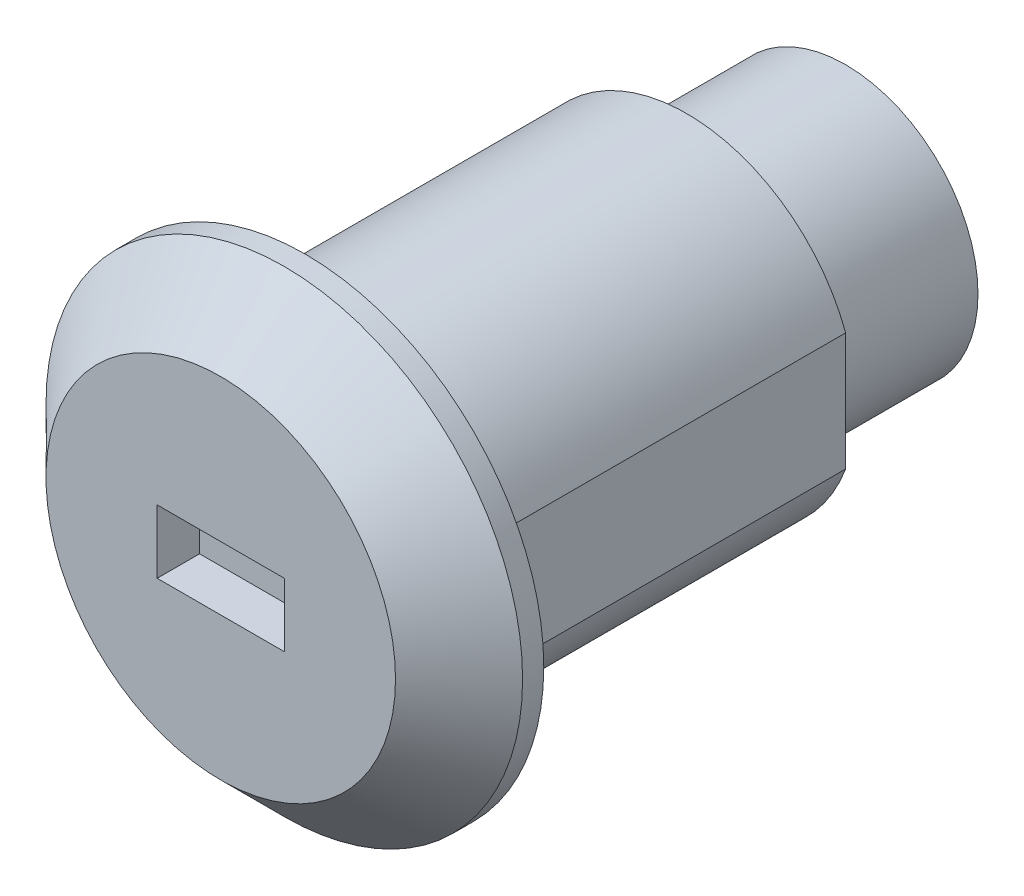
ISO-10303-21;
HEADER;
FILE_DESCRIPTION(('STEP AP214'),'2;1');
FILE_NAME('part.step','',(''),(''),'','','');
FILE_SCHEMA(('AUTOMOTIVE_DESIGN { 1 0 10303 214 1 1 1 1 }'));
ENDSEC;
DATA;
#1=APPLICATION_CONTEXT('core data for automotive mechanical design processes');
#2=APPLICATION_PROTOCOL_DEFINITION('international standard','automotive_design',2000,#1);
#3=PRODUCT_CONTEXT('',#1,'mechanical');
#4=PRODUCT('Part','Part','',(#3));
#5=PRODUCT_RELATED_PRODUCT_CATEGORY('part','',(#4));
#6=PRODUCT_DEFINITION_FORMATION('','',#4);
#7=PRODUCT_DEFINITION_CONTEXT('part definition',#1,'design');
#8=PRODUCT_DEFINITION('design','',#6,#7);
#9=PRODUCT_DEFINITION_SHAPE('','',#8);
#10=(LENGTH_UNIT() NAMED_UNIT(*) SI_UNIT(.MILLI.,.METRE.));
#11=(NAMED_UNIT(*) PLANE_ANGLE_UNIT() SI_UNIT($,.RADIAN.));
#12=(NAMED_UNIT(*) SI_UNIT($,.STERADIAN.) SOLID_ANGLE_UNIT());
#13=UNCERTAINTY_MEASURE_WITH_UNIT(LENGTH_MEASURE(1.E-05),#10,'distance_accuracy_value','');
#14=(GEOMETRIC_REPRESENTATION_CONTEXT(3) GLOBAL_UNCERTAINTY_ASSIGNED_CONTEXT((#13)) GLOBAL_UNIT_ASSIGNED_CONTEXT((#10,
#11,#12)) REPRESENTATION_CONTEXT('',''));
#15=CARTESIAN_POINT('',(0.,0.,0.));
#16=DIRECTION('',(0.,0.,1.));
#17=DIRECTION('',(1.,0.,0.));
#18=AXIS2_PLACEMENT_3D('',#15,#16,#17);
#19=CARTESIAN_POINT('',(0.,0.,-18.));
#20=DIRECTION('',(0.,0.,1.));
#21=DIRECTION('',(1.,0.,0.));
#22=AXIS2_PLACEMENT_3D('',#19,#20,#21);
#23=PLANE('',#22);
#24=DIRECTION('',(0.,1.,0.));
#25=VECTOR('',#24,1.);
#26=CARTESIAN_POINT('',(7.5,2.78388218141502,-18.));
#27=LINE('',#26,#25);
#28=CARTESIAN_POINT('',(7.5,-2.78388218141502,-18.));
#29=VERTEX_POINT('',#28);
#30=CARTESIAN_POINT('',(7.5,2.78388218141502,-18.));
#31=VERTEX_POINT('',#30);
#32=EDGE_CURVE('E112',#29,#31,#27,.T.);
#33=ORIENTED_EDGE('',*,*,#32,.F.);
#34=CARTESIAN_POINT('',(0.,0.,-18.));
#35=DIRECTION('',(0.,0.,1.));
#36=DIRECTION('',(1.,0.,0.));
#37=AXIS2_PLACEMENT_3D('',#34,#35,#36);
#38=CIRCLE('',#37,8.);
#39=CARTESIAN_POINT('',(-7.5,-2.78388218141501,-18.));
#40=VERTEX_POINT('',#39);
#41=EDGE_CURVE('E137',#40,#29,#38,.T.);
#42=ORIENTED_EDGE('',*,*,#41,.F.);
#43=DIRECTION('',(0.,-1.,0.));
#44=VECTOR('',#43,1.);
#45=CARTESIAN_POINT('',(-7.5,2.78388218141502,-18.));
#46=LINE('',#45,#44);
#47=CARTESIAN_POINT('',(-7.5,2.78388218141502,-18.));
#48=VERTEX_POINT('',#47);
#49=EDGE_CURVE('E115',#48,#40,#46,.T.);
#50=ORIENTED_EDGE('',*,*,#49,.F.);
#51=CARTESIAN_POINT('',(0.,0.,-18.));
#52=DIRECTION('',(0.,0.,1.));
#53=DIRECTION('',(1.,0.,0.));
#54=AXIS2_PLACEMENT_3D('',#51,#52,#53);
#55=CIRCLE('',#54,8.);
#56=EDGE_CURVE('E126',#31,#48,#55,.T.);
#57=ORIENTED_EDGE('',*,*,#56,.F.);
#58=EDGE_LOOP('',(#33,#42,#50,#57));
#59=FACE_BOUND('',#58,.T.);
#60=CARTESIAN_POINT('',(0.,0.,-18.));
#61=DIRECTION('',(0.,0.,1.));
#62=DIRECTION('',(1.,0.,0.));
#63=AXIS2_PLACEMENT_3D('',#60,#61,#62);
#64=CIRCLE('',#63,6.25);
#65=CARTESIAN_POINT('',(6.25,0.,-18.));
#66=VERTEX_POINT('',#65);
#67=EDGE_CURVE('E12',#66,#66,#64,.F.);
#68=ORIENTED_EDGE('',*,*,#67,.F.);
#69=EDGE_LOOP('',(#68));
#70=FACE_BOUND('',#69,.T.);
#71=ADVANCED_FACE('F37',(#59,#70),#23,.F.);
#72=CARTESIAN_POINT('',(0.,0.,0.));
#73=DIRECTION('',(0.,0.,1.));
#74=DIRECTION('',(1.,0.,0.));
#75=AXIS2_PLACEMENT_3D('',#72,#73,#74);
#76=PLANE('',#75);
#77=CARTESIAN_POINT('',(0.,0.,0.));
#78=DIRECTION('',(0.,0.,1.));
#79=DIRECTION('',(1.,0.,0.));
#80=AXIS2_PLACEMENT_3D('',#77,#78,#79);
#81=CIRCLE('',#80,11.25);
#82=CARTESIAN_POINT('',(11.25,0.,0.));
#83=VERTEX_POINT('',#82);
#84=EDGE_CURVE('E164',#83,#83,#81,.T.);
#85=ORIENTED_EDGE('',*,*,#84,.F.);
#86=EDGE_LOOP('',(#85));
#87=FACE_BOUND('',#86,.T.);
#88=DIRECTION('',(0.,1.,0.));
#89=VECTOR('',#88,1.);
#90=CARTESIAN_POINT('',(-7.5,2.78388218141502,0.));
#91=LINE('',#90,#89);
#92=CARTESIAN_POINT('',(-7.5,-2.78388218141501,0.));
#93=VERTEX_POINT('',#92);
#94=CARTESIAN_POINT('',(-7.5,2.78388218141502,0.));
#95=VERTEX_POINT('',#94);
#96=EDGE_CURVE('E52',#93,#95,#91,.T.);
#97=ORIENTED_EDGE('',*,*,#96,.F.);
#98=CARTESIAN_POINT('',(0.,0.,0.));
#99=DIRECTION('',(0.,0.,-1.));
#100=DIRECTION('',(-1.,0.,0.));
#101=AXIS2_PLACEMENT_3D('',#98,#99,#100);
#102=CIRCLE('',#101,8.);
#103=CARTESIAN_POINT('',(7.5,-2.78388218141502,0.));
#104=VERTEX_POINT('',#103);
#105=EDGE_CURVE('E57',#104,#93,#102,.T.);
#106=ORIENTED_EDGE('',*,*,#105,.F.);
#107=DIRECTION('',(0.,-1.,0.));
#108=VECTOR('',#107,1.);
#109=CARTESIAN_POINT('',(7.5,2.78388218141502,0.));
#110=LINE('',#109,#108);
#111=CARTESIAN_POINT('',(7.5,2.78388218141502,0.));
#112=VERTEX_POINT('',#111);
#113=EDGE_CURVE('E99',#112,#104,#110,.T.);
#114=ORIENTED_EDGE('',*,*,#113,.F.);
#115=CARTESIAN_POINT('',(0.,0.,0.));
#116=DIRECTION('',(0.,0.,-1.));
#117=DIRECTION('',(-1.,0.,0.));
#118=AXIS2_PLACEMENT_3D('',#115,#116,#117);
#119=CIRCLE('',#118,8.);
#120=EDGE_CURVE('E103',#95,#112,#119,.T.);
#121=ORIENTED_EDGE('',*,*,#120,.F.);
#122=EDGE_LOOP('',(#97,#106,#114,#121));
#123=FACE_BOUND('',#122,.T.);
#124=ADVANCED_FACE('F101',(#87,#123),#76,.F.);
#125=CARTESIAN_POINT('',(0.,0.,4.));
#126=DIRECTION('',(0.,0.,-1.));
#127=DIRECTION('',(-1.,0.,0.));
#128=AXIS2_PLACEMENT_3D('',#125,#126,#127);
#129=CYLINDRICAL_SURFACE('',#128,11.25);
#130=CARTESIAN_POINT('',(0.,0.,0.999999999999984));
#131=DIRECTION('',(0.,0.,1.));
#132=DIRECTION('',(1.,0.,0.));
#133=AXIS2_PLACEMENT_3D('',#130,#131,#132);
#134=CIRCLE('',#133,11.25);
#135=CARTESIAN_POINT('',(11.25,0.,0.999999999999984));
#136=VERTEX_POINT('',#135);
#137=EDGE_CURVE('E45',#136,#136,#134,.F.);
#138=ORIENTED_EDGE('',*,*,#137,.T.);
#139=EDGE_LOOP('',(#138));
#140=FACE_BOUND('',#139,.T.);
#141=ORIENTED_EDGE('',*,*,#84,.T.);
#142=EDGE_LOOP('',(#141));
#143=FACE_BOUND('',#142,.T.);
#144=ADVANCED_FACE('F39',(#140,#143),#129,.T.);
#145=CARTESIAN_POINT('',(0.,0.,4.));
#146=DIRECTION('',(0.,0.,1.));
#147=DIRECTION('',(1.,0.,0.));
#148=AXIS2_PLACEMENT_3D('',#145,#146,#147);
#149=PLANE('',#148);
#150=DIRECTION('',(0.,-1.,0.));
#151=VECTOR('',#150,1.);
#152=CARTESIAN_POINT('',(-3.,1.5,4.));
#153=LINE('',#152,#151);
#154=CARTESIAN_POINT('',(-3.,1.5,4.));
#155=VERTEX_POINT('',#154);
#156=CARTESIAN_POINT('',(-3.,-1.5,4.));
#157=VERTEX_POINT('',#156);
#158=EDGE_CURVE('E138',#155,#157,#153,.T.);
#159=ORIENTED_EDGE('',*,*,#158,.F.);
#160=DIRECTION('',(-1.,0.,0.));
#161=VECTOR('',#160,1.);
#162=CARTESIAN_POINT('',(-3.,1.5,4.));
#163=LINE('',#162,#161);
#164=CARTESIAN_POINT('',(3.,1.5,4.));
#165=VERTEX_POINT('',#164);
#166=EDGE_CURVE('E146',#165,#155,#163,.T.);
#167=ORIENTED_EDGE('',*,*,#166,.F.);
#168=DIRECTION('',(0.,1.,0.));
#169=VECTOR('',#168,1.);
#170=CARTESIAN_POINT('',(3.,1.5,4.));
#171=LINE('',#170,#169);
#172=CARTESIAN_POINT('',(3.,-1.5,4.));
#173=VERTEX_POINT('',#172);
#174=EDGE_CURVE('E143',#173,#165,#171,.T.);
#175=ORIENTED_EDGE('',*,*,#174,.F.);
#176=DIRECTION('',(1.,0.,0.));
#177=VECTOR('',#176,1.);
#178=CARTESIAN_POINT('',(-3.,-1.5,4.));
#179=LINE('',#178,#177);
#180=EDGE_CURVE('E140',#157,#173,#179,.T.);
#181=ORIENTED_EDGE('',*,*,#180,.F.);
#182=EDGE_LOOP('',(#159,#167,#175,#181));
#183=FACE_BOUND('',#182,.T.);
#184=CARTESIAN_POINT('',(0.,0.,4.));
#185=DIRECTION('',(0.,0.,1.));
#186=DIRECTION('',(1.,0.,0.));
#187=AXIS2_PLACEMENT_3D('',#184,#185,#186);
#188=CIRCLE('',#187,8.24999999999999);
#189=CARTESIAN_POINT('',(8.24999999999999,0.,4.));
#190=VERTEX_POINT('',#189);
#191=EDGE_CURVE('E173',#190,#190,#188,.T.);
#192=ORIENTED_EDGE('',*,*,#191,.T.);
#193=EDGE_LOOP('',(#192));
#194=FACE_BOUND('',#193,.T.);
#195=ADVANCED_FACE('F184',(#183,#194),#149,.T.);
#196=CARTESIAN_POINT('',(0.,0.,4.));
#197=DIRECTION('',(0.,0.,-1.));
#198=DIRECTION('',(-1.,0.,0.));
#199=AXIS2_PLACEMENT_3D('',#196,#197,#198);
#200=CONICAL_SURFACE('',#199,8.24999999999999,0.785398163397447);
#201=ORIENTED_EDGE('',*,*,#137,.F.);
#202=EDGE_LOOP('',(#201));
#203=FACE_BOUND('',#202,.T.);
#204=ORIENTED_EDGE('',*,*,#191,.F.);
#205=EDGE_LOOP('',(#204));
#206=FACE_BOUND('',#205,.T.);
#207=ADVANCED_FACE('F180',(#203,#206),#200,.T.);
#208=CARTESIAN_POINT('',(-3.,1.5,2.));
#209=DIRECTION('',(-1.,0.,0.));
#210=DIRECTION('',(0.,0.,1.));
#211=AXIS2_PLACEMENT_3D('',#208,#209,#210);
#212=PLANE('',#211);
#213=ORIENTED_EDGE('',*,*,#158,.T.);
#214=DIRECTION('',(0.,0.,1.));
#215=VECTOR('',#214,1.);
#216=CARTESIAN_POINT('',(-3.,-1.5,2.));
#217=LINE('',#216,#215);
#218=CARTESIAN_POINT('',(-3.,-1.5,2.));
#219=VERTEX_POINT('',#218);
#220=EDGE_CURVE('E161',#219,#157,#217,.T.);
#221=ORIENTED_EDGE('',*,*,#220,.F.);
#222=DIRECTION('',(0.,-1.,0.));
#223=VECTOR('',#222,1.);
#224=CARTESIAN_POINT('',(-3.,1.5,2.));
#225=LINE('',#224,#223);
#226=CARTESIAN_POINT('',(-3.,1.5,2.));
#227=VERTEX_POINT('',#226);
#228=EDGE_CURVE('E149',#227,#219,#225,.T.);
#229=ORIENTED_EDGE('',*,*,#228,.F.);
#230=DIRECTION('',(0.,0.,1.));
#231=VECTOR('',#230,1.);
#232=CARTESIAN_POINT('',(-3.,1.5,2.));
#233=LINE('',#232,#231);
#234=EDGE_CURVE('E162',#227,#155,#233,.T.);
#235=ORIENTED_EDGE('',*,*,#234,.T.);
#236=EDGE_LOOP('',(#213,#221,#229,#235));
#237=FACE_BOUND('',#236,.T.);
#238=ADVANCED_FACE('F183',(#237),#212,.F.);
#239=CARTESIAN_POINT('',(-3.,1.5,2.));
#240=DIRECTION('',(0.,1.,0.));
#241=DIRECTION('',(-1.,0.,0.));
#242=AXIS2_PLACEMENT_3D('',#239,#240,#241);
#243=PLANE('',#242);
#244=ORIENTED_EDGE('',*,*,#166,.T.);
#245=ORIENTED_EDGE('',*,*,#234,.F.);
#246=DIRECTION('',(-1.,0.,0.));
#247=VECTOR('',#246,1.);
#248=CARTESIAN_POINT('',(-3.,1.5,2.));
#249=LINE('',#248,#247);
#250=CARTESIAN_POINT('',(3.,1.5,2.));
#251=VERTEX_POINT('',#250);
#252=EDGE_CURVE('E158',#251,#227,#249,.T.);
#253=ORIENTED_EDGE('',*,*,#252,.F.);
#254=DIRECTION('',(0.,0.,1.));
#255=VECTOR('',#254,1.);
#256=CARTESIAN_POINT('',(3.,1.5,2.));
#257=LINE('',#256,#255);
#258=EDGE_CURVE('E165',#251,#165,#257,.T.);
#259=ORIENTED_EDGE('',*,*,#258,.T.);
#260=EDGE_LOOP('',(#244,#245,#253,#259));
#261=FACE_BOUND('',#260,.T.);
#262=ADVANCED_FACE('F224',(#261),#243,.F.);
#263=CARTESIAN_POINT('',(3.,1.5,2.));
#264=DIRECTION('',(1.,0.,0.));
#265=DIRECTION('',(0.,1.,0.));
#266=AXIS2_PLACEMENT_3D('',#263,#264,#265);
#267=PLANE('',#266);
#268=ORIENTED_EDGE('',*,*,#174,.T.);
#269=ORIENTED_EDGE('',*,*,#258,.F.);
#270=DIRECTION('',(0.,1.,0.));
#271=VECTOR('',#270,1.);
#272=CARTESIAN_POINT('',(3.,1.5,2.));
#273=LINE('',#272,#271);
#274=CARTESIAN_POINT('',(3.,-1.5,2.));
#275=VERTEX_POINT('',#274);
#276=EDGE_CURVE('E155',#275,#251,#273,.T.);
#277=ORIENTED_EDGE('',*,*,#276,.F.);
#278=DIRECTION('',(0.,0.,1.));
#279=VECTOR('',#278,1.);
#280=CARTESIAN_POINT('',(3.,-1.5,2.));
#281=LINE('',#280,#279);
#282=EDGE_CURVE('E167',#275,#173,#281,.T.);
#283=ORIENTED_EDGE('',*,*,#282,.T.);
#284=EDGE_LOOP('',(#268,#269,#277,#283));
#285=FACE_BOUND('',#284,.T.);
#286=ADVANCED_FACE('F227',(#285),#267,.F.);
#287=CARTESIAN_POINT('',(-3.,-1.5,2.));
#288=DIRECTION('',(0.,-1.,0.));
#289=DIRECTION('',(1.,0.,0.));
#290=AXIS2_PLACEMENT_3D('',#287,#288,#289);
#291=PLANE('',#290);
#292=ORIENTED_EDGE('',*,*,#180,.T.);
#293=ORIENTED_EDGE('',*,*,#282,.F.);
#294=DIRECTION('',(1.,0.,0.));
#295=VECTOR('',#294,1.);
#296=CARTESIAN_POINT('',(-3.,-1.5,2.));
#297=LINE('',#296,#295);
#298=EDGE_CURVE('E152',#219,#275,#297,.T.);
#299=ORIENTED_EDGE('',*,*,#298,.F.);
#300=ORIENTED_EDGE('',*,*,#220,.T.);
#301=EDGE_LOOP('',(#292,#293,#299,#300));
#302=FACE_BOUND('',#301,.T.);
#303=ADVANCED_FACE('F222',(#302),#291,.F.);
#304=CARTESIAN_POINT('',(-3.,-1.5,2.));
#305=DIRECTION('',(0.,0.,1.));
#306=DIRECTION('',(1.,0.,0.));
#307=AXIS2_PLACEMENT_3D('',#304,#305,#306);
#308=PLANE('',#307);
#309=ORIENTED_EDGE('',*,*,#228,.T.);
#310=ORIENTED_EDGE('',*,*,#298,.T.);
#311=ORIENTED_EDGE('',*,*,#276,.T.);
#312=ORIENTED_EDGE('',*,*,#252,.T.);
#313=EDGE_LOOP('',(#309,#310,#311,#312));
#314=FACE_BOUND('',#313,.T.);
#315=ADVANCED_FACE('F211',(#314),#308,.T.);
#316=CARTESIAN_POINT('',(-7.5,2.78388218141502,-61.9317121994613));
#317=DIRECTION('',(1.,0.,0.));
#318=DIRECTION('',(0.,1.,0.));
#319=AXIS2_PLACEMENT_3D('',#316,#317,#318);
#320=PLANE('',#319);
#321=DIRECTION('',(0.,0.,1.));
#322=VECTOR('',#321,1.);
#323=CARTESIAN_POINT('',(-7.5,2.78388218141502,-61.9317121994613));
#324=LINE('',#323,#322);
#325=EDGE_CURVE('E120',#48,#95,#324,.T.);
#326=ORIENTED_EDGE('',*,*,#325,.F.);
#327=ORIENTED_EDGE('',*,*,#49,.T.);
#328=DIRECTION('',(0.,0.,1.));
#329=VECTOR('',#328,1.);
#330=CARTESIAN_POINT('',(-7.5,-2.78388218141501,-61.9317121994613));
#331=LINE('',#330,#329);
#332=EDGE_CURVE('E132',#40,#93,#331,.T.);
#333=ORIENTED_EDGE('',*,*,#332,.T.);
#334=ORIENTED_EDGE('',*,*,#96,.T.);
#335=EDGE_LOOP('',(#326,#327,#333,#334));
#336=FACE_BOUND('',#335,.T.);
#337=ADVANCED_FACE('F207',(#336),#320,.F.);
#338=CARTESIAN_POINT('',(0.,0.,-61.9317121994613));
#339=DIRECTION('',(0.,0.,1.));
#340=DIRECTION('',(1.,0.,0.));
#341=AXIS2_PLACEMENT_3D('',#338,#339,#340);
#342=CYLINDRICAL_SURFACE('',#341,8.);
#343=ORIENTED_EDGE('',*,*,#332,.F.);
#344=ORIENTED_EDGE('',*,*,#41,.T.);
#345=DIRECTION('',(0.,0.,1.));
#346=VECTOR('',#345,1.);
#347=CARTESIAN_POINT('',(7.5,-2.78388218141502,-61.9317121994613));
#348=LINE('',#347,#346);
#349=EDGE_CURVE('E116',#29,#104,#348,.T.);
#350=ORIENTED_EDGE('',*,*,#349,.T.);
#351=ORIENTED_EDGE('',*,*,#105,.T.);
#352=EDGE_LOOP('',(#343,#344,#350,#351));
#353=FACE_BOUND('',#352,.T.);
#354=ADVANCED_FACE('F210',(#353),#342,.T.);
#355=CARTESIAN_POINT('',(7.5,2.78388218141502,-61.9317121994613));
#356=DIRECTION('',(-1.,0.,0.));
#357=DIRECTION('',(0.,0.,1.));
#358=AXIS2_PLACEMENT_3D('',#355,#356,#357);
#359=PLANE('',#358);
#360=ORIENTED_EDGE('',*,*,#349,.F.);
#361=ORIENTED_EDGE('',*,*,#32,.T.);
#362=DIRECTION('',(0.,0.,1.));
#363=VECTOR('',#362,1.);
#364=CARTESIAN_POINT('',(7.5,2.78388218141502,-61.9317121994613));
#365=LINE('',#364,#363);
#366=EDGE_CURVE('E110',#31,#112,#365,.T.);
#367=ORIENTED_EDGE('',*,*,#366,.T.);
#368=ORIENTED_EDGE('',*,*,#113,.T.);
#369=EDGE_LOOP('',(#360,#361,#367,#368));
#370=FACE_BOUND('',#369,.T.);
#371=ADVANCED_FACE('F111',(#370),#359,.F.);
#372=CARTESIAN_POINT('',(0.,0.,-61.9317121994613));
#373=DIRECTION('',(0.,0.,1.));
#374=DIRECTION('',(1.,0.,0.));
#375=AXIS2_PLACEMENT_3D('',#372,#373,#374);
#376=CYLINDRICAL_SURFACE('',#375,8.);
#377=ORIENTED_EDGE('',*,*,#366,.F.);
#378=ORIENTED_EDGE('',*,*,#56,.T.);
#379=ORIENTED_EDGE('',*,*,#325,.T.);
#380=ORIENTED_EDGE('',*,*,#120,.T.);
#381=EDGE_LOOP('',(#377,#378,#379,#380));
#382=FACE_BOUND('',#381,.T.);
#383=ADVANCED_FACE('F118',(#382),#376,.T.);
#384=CARTESIAN_POINT('',(0.,0.,-72.6776695296637));
#385=DIRECTION('',(0.,0.,1.));
#386=DIRECTION('',(1.,0.,0.));
#387=AXIS2_PLACEMENT_3D('',#384,#385,#386);
#388=CYLINDRICAL_SURFACE('',#387,6.25);
#389=CARTESIAN_POINT('',(0.,0.,-25.5));
#390=DIRECTION('',(0.,0.,1.));
#391=DIRECTION('',(1.,0.,0.));
#392=AXIS2_PLACEMENT_3D('',#389,#390,#391);
#393=CIRCLE('',#392,6.25);
#394=CARTESIAN_POINT('',(6.25,0.,-25.5));
#395=VERTEX_POINT('',#394);
#396=EDGE_CURVE('E121',#395,#395,#393,.T.);
#397=CARTESIAN_POINT('',(6.25,0.,-25.5));
#398=CARTESIAN_POINT('',(6.25,0.,-25.421875));
#399=CARTESIAN_POINT('',(6.25,0.,-25.34375));
#400=CARTESIAN_POINT('',(6.25,0.,-25.1875));
#401=CARTESIAN_POINT('',(6.25,0.,-25.109375));
#402=CARTESIAN_POINT('',(6.25,0.,-24.953125));
#403=CARTESIAN_POINT('',(6.25,0.,-24.875));
#404=CARTESIAN_POINT('',(6.25,0.,-24.71875));
#405=CARTESIAN_POINT('',(6.25,0.,-24.640625));
#406=CARTESIAN_POINT('',(6.25,0.,-24.484375));
#407=CARTESIAN_POINT('',(6.25,0.,-24.40625));
#408=CARTESIAN_POINT('',(6.25,0.,-24.25));
#409=CARTESIAN_POINT('',(6.25,0.,-24.171875));
#410=CARTESIAN_POINT('',(6.25,0.,-24.015625));
#411=CARTESIAN_POINT('',(6.25,0.,-23.9375));
#412=CARTESIAN_POINT('',(6.25,0.,-23.78125));
#413=CARTESIAN_POINT('',(6.25,0.,-23.703125));
#414=CARTESIAN_POINT('',(6.25,0.,-23.546875));
#415=CARTESIAN_POINT('',(6.25,0.,-23.46875));
#416=CARTESIAN_POINT('',(6.25,0.,-23.3125));
#417=CARTESIAN_POINT('',(6.25,0.,-23.234375));
#418=CARTESIAN_POINT('',(6.25,0.,-23.078125));
#419=CARTESIAN_POINT('',(6.25,0.,-23.));
#420=CARTESIAN_POINT('',(6.25,0.,-22.84375));
#421=CARTESIAN_POINT('',(6.25,0.,-22.765625));
#422=CARTESIAN_POINT('',(6.25,0.,-22.609375));
#423=CARTESIAN_POINT('',(6.25,0.,-22.53125));
#424=CARTESIAN_POINT('',(6.25,0.,-22.375));
#425=CARTESIAN_POINT('',(6.25,0.,-22.296875));
#426=CARTESIAN_POINT('',(6.25,0.,-22.140625));
#427=CARTESIAN_POINT('',(6.25,0.,-22.0625));
#428=CARTESIAN_POINT('',(6.25,0.,-21.90625));
#429=CARTESIAN_POINT('',(6.25,0.,-21.828125));
#430=CARTESIAN_POINT('',(6.25,0.,-21.671875));
#431=CARTESIAN_POINT('',(6.25,0.,-21.59375));
#432=CARTESIAN_POINT('',(6.25,0.,-21.4375));
#433=CARTESIAN_POINT('',(6.25,0.,-21.359375));
#434=CARTESIAN_POINT('',(6.25,0.,-21.203125));
#435=CARTESIAN_POINT('',(6.25,0.,-21.125));
#436=CARTESIAN_POINT('',(6.25,0.,-20.96875));
#437=CARTESIAN_POINT('',(6.25,0.,-20.890625));
#438=CARTESIAN_POINT('',(6.25,0.,-20.734375));
#439=CARTESIAN_POINT('',(6.25,0.,-20.65625));
#440=CARTESIAN_POINT('',(6.25,0.,-20.5));
#441=CARTESIAN_POINT('',(6.25,0.,-20.421875));
#442=CARTESIAN_POINT('',(6.25,0.,-20.265625));
#443=CARTESIAN_POINT('',(6.25,0.,-20.1875));
#444=CARTESIAN_POINT('',(6.25,0.,-20.03125));
#445=CARTESIAN_POINT('',(6.25,0.,-19.953125));
#446=CARTESIAN_POINT('',(6.25,0.,-19.796875));
#447=CARTESIAN_POINT('',(6.25,0.,-19.71875));
#448=CARTESIAN_POINT('',(6.25,0.,-19.5625));
#449=CARTESIAN_POINT('',(6.25,0.,-19.484375));
#450=CARTESIAN_POINT('',(6.25,0.,-19.328125));
#451=CARTESIAN_POINT('',(6.25,0.,-19.25));
#452=CARTESIAN_POINT('',(6.25,0.,-19.09375));
#453=CARTESIAN_POINT('',(6.25,0.,-19.015625));
#454=CARTESIAN_POINT('',(6.25,0.,-18.859375));
#455=CARTESIAN_POINT('',(6.25,0.,-18.78125));
#456=CARTESIAN_POINT('',(6.25,0.,-18.625));
#457=CARTESIAN_POINT('',(6.25,0.,-18.546875));
#458=CARTESIAN_POINT('',(6.25,0.,-18.390625));
#459=CARTESIAN_POINT('',(6.25,0.,-18.3125));
#460=CARTESIAN_POINT('',(6.25,0.,-18.15625));
#461=CARTESIAN_POINT('',(6.25,0.,-18.078125));
#462=CARTESIAN_POINT('',(6.25,0.,-18.));
#463=B_SPLINE_CURVE_WITH_KNOTS('',3,(#397,#398,#399,#400,#401,#402,#403,#404,#405,#406,#407,
#408,#409,#410,#411,#412,#413,#414,#415,#416,#417,#418,#419,#420,#421,#422,#423,#424,#425,#426,
#427,#428,#429,#430,#431,#432,#433,#434,#435,#436,#437,#438,#439,#440,#441,#442,#443,#444,#445,
#446,#447,#448,#449,#450,#451,#452,#453,#454,#455,#456,#457,#458,#459,#460,#461,#462),
.UNSPECIFIED.,.F.,.F.,(4,2,2,2,2,2,2,2,2,2,2,2,2,2,2,2,2,2,2,2,2,2,2,2,2,2,2,2,2,2,2,2,4),(0.,
0.234375000000002,0.468749999999997,0.703124999999999,0.937500000000001,1.171875,1.40625,
1.640625,1.875,2.109375,2.34375,2.578125,2.8125,3.046875,3.28125,3.51562499999999,3.75,3.984375,
4.21874999999999,4.453125,4.6875,4.92187499999999,5.15624999999999,5.390625,5.62499999999999,
5.85937499999999,6.09374999999999,6.32812499999999,6.56249999999999,6.79687499999999,7.03125,
7.26562499999999,7.49999999999999),.UNSPECIFIED.);
#464=EDGE_CURVE('BSEAM205',#395,#66,#463,.T.);
#465=ORIENTED_EDGE('',*,*,#396,.T.);
#466=ORIENTED_EDGE('',*,*,#67,.T.);
#467=ORIENTED_EDGE('',*,*,#464,.T.);
#468=ORIENTED_EDGE('',*,*,#464,.F.);
#469=EDGE_LOOP('',(#465,#467,#466,#468));
#470=FACE_BOUND('',#469,.T.);
#471=ADVANCED_FACE('F205',(#470),#388,.T.);
#472=CARTESIAN_POINT('',(0.,0.,-25.5));
#473=DIRECTION('',(0.,0.,1.));
#474=DIRECTION('',(1.,0.,0.));
#475=AXIS2_PLACEMENT_3D('',#472,#473,#474);
#476=PLANE('',#475);
#477=ORIENTED_EDGE('',*,*,#396,.F.);
#478=EDGE_LOOP('',(#477));
#479=FACE_BOUND('',#478,.T.);
#480=ADVANCED_FACE('F287',(#479),#476,.F.);
#481=CLOSED_SHELL('',(#71,#124,#144,#195,#207,#238,#262,#286,#303,#315,#337,#354,#371,#383,#471,#480));
#482=MANIFOLD_SOLID_BREP('B2',#481);
#483=ADVANCED_BREP_SHAPE_REPRESENTATION('',(#18,#482),#14);
#484=SHAPE_DEFINITION_REPRESENTATION(#9,#483);
ENDSEC;
END-ISO-10303-21;
